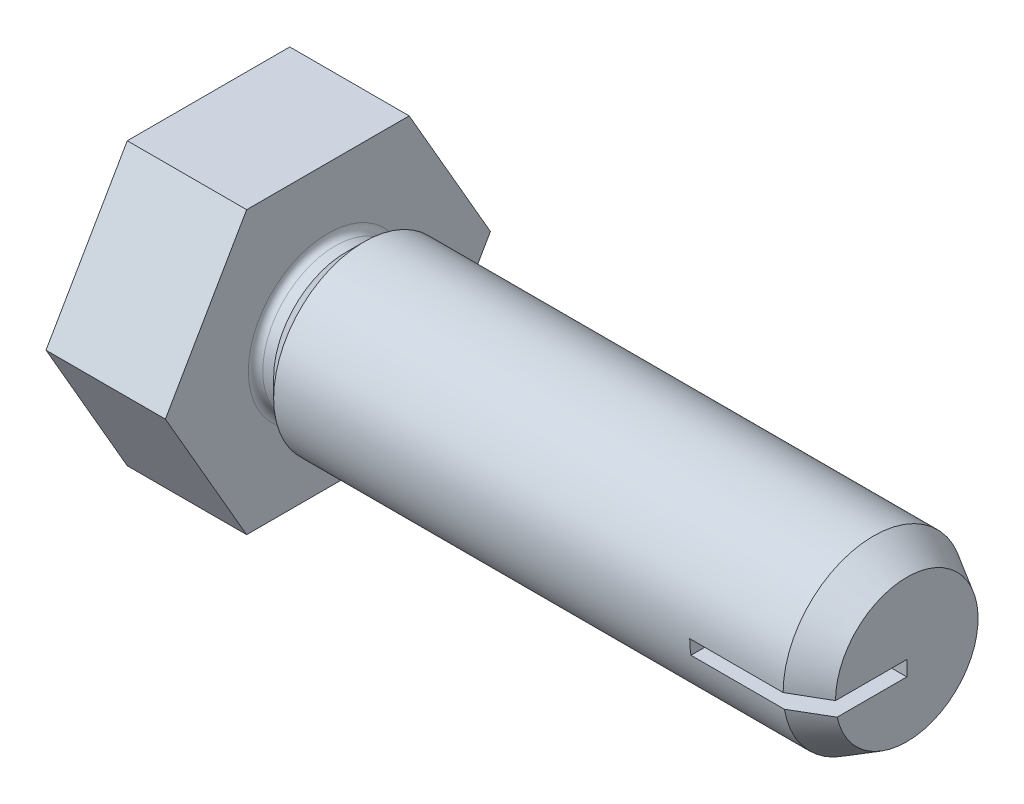
ISO-10303-21;
HEADER;
FILE_DESCRIPTION(('STEP AP214'),'2;1');
FILE_NAME('part.step','',(''),(''),'','','');
FILE_SCHEMA(('AUTOMOTIVE_DESIGN { 1 0 10303 214 1 1 1 1 }'));
ENDSEC;
DATA;
#1=APPLICATION_CONTEXT('core data for automotive mechanical design processes');
#2=APPLICATION_PROTOCOL_DEFINITION('international standard','automotive_design',2000,#1);
#3=PRODUCT_CONTEXT('',#1,'mechanical');
#4=PRODUCT('Part','Part','',(#3));
#5=PRODUCT_RELATED_PRODUCT_CATEGORY('part','',(#4));
#6=PRODUCT_DEFINITION_FORMATION('','',#4);
#7=PRODUCT_DEFINITION_CONTEXT('part definition',#1,'design');
#8=PRODUCT_DEFINITION('design','',#6,#7);
#9=PRODUCT_DEFINITION_SHAPE('','',#8);
#10=(LENGTH_UNIT() NAMED_UNIT(*) SI_UNIT(.MILLI.,.METRE.));
#11=(NAMED_UNIT(*) PLANE_ANGLE_UNIT() SI_UNIT($,.RADIAN.));
#12=(NAMED_UNIT(*) SI_UNIT($,.STERADIAN.) SOLID_ANGLE_UNIT());
#13=UNCERTAINTY_MEASURE_WITH_UNIT(LENGTH_MEASURE(1.E-05),#10,'distance_accuracy_value','');
#14=(GEOMETRIC_REPRESENTATION_CONTEXT(3) GLOBAL_UNCERTAINTY_ASSIGNED_CONTEXT((#13)) GLOBAL_UNIT_ASSIGNED_CONTEXT((#10,
#11,#12)) REPRESENTATION_CONTEXT('',''));
#15=CARTESIAN_POINT('',(0.,0.,0.));
#16=DIRECTION('',(0.,0.,1.));
#17=DIRECTION('',(1.,0.,0.));
#18=AXIS2_PLACEMENT_3D('',#15,#16,#17);
#19=CARTESIAN_POINT('',(0.,0.,0.));
#20=DIRECTION('',(-1.,0.,0.));
#21=DIRECTION('',(0.,0.,1.));
#22=AXIS2_PLACEMENT_3D('',#19,#20,#21);
#23=CYLINDRICAL_SURFACE('',#22,2.5);
#24=CARTESIAN_POINT('',(1.,0.,0.));
#25=DIRECTION('',(-1.,0.,0.));
#26=DIRECTION('',(0.,0.,1.));
#27=AXIS2_PLACEMENT_3D('',#24,#25,#26);
#28=CIRCLE('',#27,2.5);
#29=CARTESIAN_POINT('',(1.,0.,2.5));
#30=VERTEX_POINT('',#29);
#31=EDGE_CURVE('E234',#30,#30,#28,.T.);
#32=ORIENTED_EDGE('',*,*,#31,.F.);
#33=EDGE_LOOP('',(#32));
#34=FACE_BOUND('',#33,.T.);
#35=DIRECTION('',(-1.,0.,0.));
#36=VECTOR('',#35,1.);
#37=CARTESIAN_POINT('',(0.,0.,2.5));
#38=LINE('',#37,#36);
#39=CARTESIAN_POINT('',(15.0820130719885,0.,2.5));
#40=VERTEX_POINT('',#39);
#41=CARTESIAN_POINT('',(12.5,0.,2.5));
#42=VERTEX_POINT('',#41);
#43=EDGE_CURVE('E267',#40,#42,#38,.T.);
#44=ORIENTED_EDGE('',*,*,#43,.F.);
#45=CARTESIAN_POINT('',(15.0820130719885,0.,0.));
#46=DIRECTION('',(-1.,0.,0.));
#47=DIRECTION('',(0.,0.,1.));
#48=AXIS2_PLACEMENT_3D('',#45,#46,#47);
#49=CIRCLE('',#48,2.5);
#50=CARTESIAN_POINT('',(15.0820130719885,-0.416666666666667,2.46503324295817));
#51=VERTEX_POINT('',#50);
#52=EDGE_CURVE('E266',#40,#51,#49,.T.);
#53=ORIENTED_EDGE('',*,*,#52,.T.);
#54=DIRECTION('',(-1.,0.,0.));
#55=VECTOR('',#54,1.);
#56=CARTESIAN_POINT('',(0.,-0.416666666666669,2.46503324295817));
#57=LINE('',#56,#55);
#58=CARTESIAN_POINT('',(12.5,-0.416666666666667,2.46503324295817));
#59=VERTEX_POINT('',#58);
#60=EDGE_CURVE('E268',#59,#51,#57,.F.);
#61=ORIENTED_EDGE('',*,*,#60,.F.);
#62=CARTESIAN_POINT('',(12.5,0.,0.));
#63=DIRECTION('',(1.,0.,0.));
#64=DIRECTION('',(0.,0.,-1.));
#65=AXIS2_PLACEMENT_3D('',#62,#63,#64);
#66=CIRCLE('',#65,2.5);
#67=EDGE_CURVE('E99',#42,#59,#66,.T.);
#68=ORIENTED_EDGE('',*,*,#67,.F.);
#69=EDGE_LOOP('',(#44,#53,#61,#68));
#70=FACE_BOUND('',#69,.T.);
#71=ADVANCED_FACE('F125',(#34,#70),#23,.T.);
#72=CARTESIAN_POINT('',(15.0820130719885,0.,0.));
#73=DIRECTION('',(-1.,0.,0.));
#74=DIRECTION('',(0.,0.,1.));
#75=AXIS2_PLACEMENT_3D('',#72,#73,#74);
#76=CONICAL_SURFACE('',#75,2.5,0.523598775598292);
#77=ORIENTED_EDGE('',*,*,#52,.F.);
#78=DIRECTION('',(-0.866025403784442,0.,0.499999999999994));
#79=VECTOR('',#78,1.);
#80=CARTESIAN_POINT('',(19.4121400909107,0.,0.));
#81=LINE('',#80,#79);
#82=CARTESIAN_POINT('',(16.,0.,1.97));
#83=VERTEX_POINT('',#82);
#84=EDGE_CURVE('E247',#40,#83,#81,.F.);
#85=ORIENTED_EDGE('',*,*,#84,.T.);
#86=CARTESIAN_POINT('',(16.,0.,0.));
#87=DIRECTION('',(-1.,0.,0.));
#88=DIRECTION('',(0.,0.,1.));
#89=AXIS2_PLACEMENT_3D('',#86,#87,#88);
#90=CIRCLE('',#89,1.97);
#91=CARTESIAN_POINT('',(16.,-0.416666666666667,1.92543213042914));
#92=VERTEX_POINT('',#91);
#93=EDGE_CURVE('E264',#83,#92,#90,.T.);
#94=ORIENTED_EDGE('',*,*,#93,.T.);
#95=CARTESIAN_POINT('',(18.08614728264,-0.416666666666666,0.642241801362555));
#96=CARTESIAN_POINT('',(18.0510723416986,-0.416666666666666,0.666370497439099));
#97=CARTESIAN_POINT('',(18.0158209182071,-0.416666666666666,0.690239439500695));
#98=CARTESIAN_POINT('',(17.9450410807476,-0.416666666666666,0.737559607858169));
#99=CARTESIAN_POINT('',(17.9095126807947,-0.416666666666666,0.761010855094915));
#100=CARTESIAN_POINT('',(17.8026301976947,-0.416666666666666,0.830888074114942));
#101=CARTESIAN_POINT('',(17.7309693877561,-0.416666666666666,0.876843936993016));
#102=CARTESIAN_POINT('',(17.5871601845939,-0.416666666666666,0.967946816020336));
#103=CARTESIAN_POINT('',(17.5150119024295,-0.416666666666667,1.01309400838144));
#104=CARTESIAN_POINT('',(17.3703728328953,-0.416666666666667,1.1028426647793));
#105=CARTESIAN_POINT('',(17.2978820308339,-0.416666666666667,1.14744410510748));
#106=CARTESIAN_POINT('',(17.0861944626295,-0.416666666666667,1.27692130677648));
#107=CARTESIAN_POINT('',(16.946685589256,-0.416666666666667,1.36128610719151));
#108=CARTESIAN_POINT('',(16.6671871516271,-0.416666666666667,1.52921629261561));
#109=CARTESIAN_POINT('',(16.5271975820463,-0.416666666666667,1.61278166872952));
#110=CARTESIAN_POINT('',(16.1067337354645,-0.416666666666667,1.86277016745075));
#111=CARTESIAN_POINT('',(15.8258193014455,-0.416666666666667,2.02845244493768));
#112=CARTESIAN_POINT('',(15.3306932141405,-0.416666666666667,2.31940386962061));
#113=CARTESIAN_POINT('',(15.1165930973966,-0.416666666666667,2.44486357747066));
#114=CARTESIAN_POINT('',(14.6881891618265,-0.416666666666667,2.69543503391963));
#115=CARTESIAN_POINT('',(14.4738853429846,-0.416666666666667,2.82054678249146));
#116=CARTESIAN_POINT('',(14.0452309287218,-0.416666666666667,3.07049358647508));
#117=CARTESIAN_POINT('',(13.8308803859553,-0.416666666666667,3.19532873226625));
#118=CARTESIAN_POINT('',(13.4020836117564,-0.416666666666667,3.4448338547915));
#119=CARTESIAN_POINT('',(13.1876373804678,-0.416666666666667,3.56950383177238));
#120=CARTESIAN_POINT('',(12.9731611797261,-0.416666666666667,3.69412218194189));
#121=B_SPLINE_CURVE_WITH_KNOTS('',3,(#95,#96,#97,#98,#99,#100,#101,#102,#103,#104,#105,#106,
#107,#108,#109,#110,#111,#112,#113,#114,#115,#116,#117,#118,#119,#120),.UNSPECIFIED.,.F.,.F.,(4,
2,2,2,2,2,2,2,2,2,2,2,4),(0.,0.127714662585985,0.255422904152005,0.510805146378886,
0.766131045879196,1.02146799814593,1.51056493988736,1.99966731748115,2.97806477299339,
3.72251831916647,4.4669719232861,5.21112892497218,5.95528481348288),.UNSPECIFIED.);
#122=EDGE_CURVE('E459',#92,#51,#121,.T.);
#123=ORIENTED_EDGE('',*,*,#122,.T.);
#124=EDGE_LOOP('',(#77,#85,#94,#123));
#125=FACE_BOUND('',#124,.T.);
#126=ADVANCED_FACE('F261',(#125),#76,.T.);
#127=CARTESIAN_POINT('',(16.,2.5,0.));
#128=DIRECTION('',(-1.,0.,0.));
#129=DIRECTION('',(0.,0.,1.));
#130=AXIS2_PLACEMENT_3D('',#127,#128,#129);
#131=PLANE('',#130);
#132=DIRECTION('',(0.,0.,1.));
#133=VECTOR('',#132,1.);
#134=CARTESIAN_POINT('',(16.,0.,0.));
#135=LINE('',#134,#133);
#136=CARTESIAN_POINT('',(16.,0.,0.));
#137=VERTEX_POINT('',#136);
#138=EDGE_CURVE('E133',#137,#83,#135,.T.);
#139=ORIENTED_EDGE('',*,*,#138,.F.);
#140=DIRECTION('',(0.,1.,0.));
#141=VECTOR('',#140,1.);
#142=CARTESIAN_POINT('',(16.,0.,0.));
#143=LINE('',#142,#141);
#144=CARTESIAN_POINT('',(16.,-0.416666666666667,0.));
#145=VERTEX_POINT('',#144);
#146=EDGE_CURVE('E493',#145,#137,#143,.T.);
#147=ORIENTED_EDGE('',*,*,#146,.F.);
#148=DIRECTION('',(0.,0.,-1.));
#149=VECTOR('',#148,1.);
#150=CARTESIAN_POINT('',(16.,-0.416666666666667,0.));
#151=LINE('',#150,#149);
#152=EDGE_CURVE('E237',#92,#145,#151,.T.);
#153=ORIENTED_EDGE('',*,*,#152,.F.);
#154=ORIENTED_EDGE('',*,*,#93,.F.);
#155=EDGE_LOOP('',(#139,#147,#153,#154));
#156=FACE_BOUND('',#155,.T.);
#157=ADVANCED_FACE('F271',(#156),#131,.F.);
#158=CARTESIAN_POINT('',(1.,0.,0.));
#159=DIRECTION('',(1.,0.,0.));
#160=DIRECTION('',(0.,0.,-1.));
#161=AXIS2_PLACEMENT_3D('',#158,#159,#160);
#162=CONICAL_SURFACE('',#161,2.5,0.78539816339745);
#163=CARTESIAN_POINT('',(0.500000000000003,0.,0.));
#164=DIRECTION('',(-1.,0.,0.));
#165=DIRECTION('',(0.,0.,1.));
#166=AXIS2_PLACEMENT_3D('',#163,#164,#165);
#167=CIRCLE('',#166,2.);
#168=CARTESIAN_POINT('',(0.500000000000003,0.,2.));
#169=VERTEX_POINT('',#168);
#170=EDGE_CURVE('E231',#169,#169,#167,.T.);
#171=ORIENTED_EDGE('',*,*,#170,.F.);
#172=EDGE_LOOP('',(#171));
#173=FACE_BOUND('',#172,.T.);
#174=ORIENTED_EDGE('',*,*,#31,.T.);
#175=EDGE_LOOP('',(#174));
#176=FACE_BOUND('',#175,.T.);
#177=ADVANCED_FACE('F325',(#173,#176),#162,.T.);
#178=CARTESIAN_POINT('',(0.,0.,0.));
#179=DIRECTION('',(-1.,0.,0.));
#180=DIRECTION('',(0.,0.,1.));
#181=AXIS2_PLACEMENT_3D('',#178,#179,#180);
#182=CYLINDRICAL_SURFACE('',#181,2.);
#183=CARTESIAN_POINT('',(0.200000000000001,0.,0.));
#184=DIRECTION('',(-1.,0.,0.));
#185=DIRECTION('',(0.,0.,1.));
#186=AXIS2_PLACEMENT_3D('',#183,#184,#185);
#187=CIRCLE('',#186,2.);
#188=CARTESIAN_POINT('',(0.200000000000001,0.,2.));
#189=VERTEX_POINT('',#188);
#190=EDGE_CURVE('E227',#189,#189,#187,.T.);
#191=ORIENTED_EDGE('',*,*,#190,.F.);
#192=EDGE_LOOP('',(#191));
#193=FACE_BOUND('',#192,.T.);
#194=ORIENTED_EDGE('',*,*,#170,.T.);
#195=EDGE_LOOP('',(#194));
#196=FACE_BOUND('',#195,.T.);
#197=ADVANCED_FACE('F331',(#193,#196),#182,.T.);
#198=CARTESIAN_POINT('',(0.200000000000001,0.,0.));
#199=DIRECTION('',(-1.,0.,0.));
#200=DIRECTION('',(0.,0.,1.));
#201=AXIS2_PLACEMENT_3D('',#198,#199,#200);
#202=TOROIDAL_SURFACE('',#201,2.2,0.2);
#203=CARTESIAN_POINT('',(0.,0.,0.));
#204=DIRECTION('',(-1.,0.,0.));
#205=DIRECTION('',(0.,0.,1.));
#206=AXIS2_PLACEMENT_3D('',#203,#204,#205);
#207=CIRCLE('',#206,2.2);
#208=CARTESIAN_POINT('',(0.,0.,2.2));
#209=VERTEX_POINT('',#208);
#210=EDGE_CURVE('E224',#209,#209,#207,.T.);
#211=ORIENTED_EDGE('',*,*,#210,.F.);
#212=EDGE_LOOP('',(#211));
#213=FACE_BOUND('',#212,.T.);
#214=ORIENTED_EDGE('',*,*,#190,.T.);
#215=EDGE_LOOP('',(#214));
#216=FACE_BOUND('',#215,.T.);
#217=ADVANCED_FACE('F336',(#213,#216),#202,.F.);
#218=CARTESIAN_POINT('',(0.,3.89,0.));
#219=DIRECTION('',(-1.,0.,0.));
#220=DIRECTION('',(0.,0.,1.));
#221=AXIS2_PLACEMENT_3D('',#218,#219,#220);
#222=PLANE('',#221);
#223=DIRECTION('',(0.,0.866025403784439,0.5));
#224=VECTOR('',#223,1.);
#225=CARTESIAN_POINT('',(0.,1.945,-3.36883882072147));
#226=LINE('',#225,#224);
#227=CARTESIAN_POINT('',(0.,0.,-4.49178509429529));
#228=VERTEX_POINT('',#227);
#229=CARTESIAN_POINT('',(0.,3.89,-2.24589254714765));
#230=VERTEX_POINT('',#229);
#231=EDGE_CURVE('E149',#228,#230,#226,.T.);
#232=ORIENTED_EDGE('',*,*,#231,.T.);
#233=DIRECTION('',(0.,0.,1.));
#234=VECTOR('',#233,1.);
#235=CARTESIAN_POINT('',(0.,3.89,0.));
#236=LINE('',#235,#234);
#237=CARTESIAN_POINT('',(0.,3.89,2.24589254714765));
#238=VERTEX_POINT('',#237);
#239=EDGE_CURVE('E283',#230,#238,#236,.T.);
#240=ORIENTED_EDGE('',*,*,#239,.T.);
#241=DIRECTION('',(0.,-0.866025403784439,0.5));
#242=VECTOR('',#241,1.);
#243=CARTESIAN_POINT('',(0.,0.,4.49178509429529));
#244=LINE('',#243,#242);
#245=CARTESIAN_POINT('',(0.,0.,4.49178509429529));
#246=VERTEX_POINT('',#245);
#247=EDGE_CURVE('E204',#238,#246,#244,.T.);
#248=ORIENTED_EDGE('',*,*,#247,.T.);
#249=DIRECTION('',(0.,-0.866025403784439,-0.5));
#250=VECTOR('',#249,1.);
#251=CARTESIAN_POINT('',(0.,-3.89,2.24589254714765));
#252=LINE('',#251,#250);
#253=CARTESIAN_POINT('',(0.,-3.89,2.24589254714765));
#254=VERTEX_POINT('',#253);
#255=EDGE_CURVE('E198',#246,#254,#252,.T.);
#256=ORIENTED_EDGE('',*,*,#255,.T.);
#257=DIRECTION('',(0.,0.,-1.));
#258=VECTOR('',#257,1.);
#259=CARTESIAN_POINT('',(0.,-3.89,-2.24589254714764));
#260=LINE('',#259,#258);
#261=CARTESIAN_POINT('',(0.,-3.89,-2.24589254714764));
#262=VERTEX_POINT('',#261);
#263=EDGE_CURVE('E188',#254,#262,#260,.T.);
#264=ORIENTED_EDGE('',*,*,#263,.T.);
#265=DIRECTION('',(0.,0.866025403784439,-0.5));
#266=VECTOR('',#265,1.);
#267=CARTESIAN_POINT('',(0.,-1.945,-3.36883882072147));
#268=LINE('',#267,#266);
#269=EDGE_CURVE('E228',#262,#228,#268,.T.);
#270=ORIENTED_EDGE('',*,*,#269,.T.);
#271=EDGE_LOOP('',(#232,#240,#248,#256,#264,#270));
#272=FACE_BOUND('',#271,.T.);
#273=ORIENTED_EDGE('',*,*,#210,.T.);
#274=EDGE_LOOP('',(#273));
#275=FACE_BOUND('',#274,.T.);
#276=ADVANCED_FACE('F201',(#272,#275),#222,.F.);
#277=CARTESIAN_POINT('',(11.8841463022521,-1.945,-3.36883882072147));
#278=DIRECTION('',(0.,-0.5,-0.866025403784438));
#279=DIRECTION('',(0.,0.866025403784439,-0.5));
#280=AXIS2_PLACEMENT_3D('',#277,#278,#279);
#281=PLANE('',#280);
#282=DIRECTION('',(-1.,0.,0.));
#283=VECTOR('',#282,1.);
#284=CARTESIAN_POINT('',(11.8841463022521,-3.89,-2.24589254714764));
#285=LINE('',#284,#283);
#286=CARTESIAN_POINT('',(-3.3,-3.89,-2.24589254714764));
#287=VERTEX_POINT('',#286);
#288=EDGE_CURVE('E196',#262,#287,#285,.T.);
#289=ORIENTED_EDGE('',*,*,#288,.T.);
#290=DIRECTION('',(0.,-0.866025403784439,0.5));
#291=VECTOR('',#290,1.);
#292=CARTESIAN_POINT('',(-3.3,-1.945,-3.36883882072147));
#293=LINE('',#292,#291);
#294=CARTESIAN_POINT('',(-3.3,0.,-4.49178509429529));
#295=VERTEX_POINT('',#294);
#296=EDGE_CURVE('E282',#295,#287,#293,.T.);
#297=ORIENTED_EDGE('',*,*,#296,.F.);
#298=DIRECTION('',(-1.,0.,0.));
#299=VECTOR('',#298,1.);
#300=CARTESIAN_POINT('',(11.8841463022521,0.,-4.49178509429529));
#301=LINE('',#300,#299);
#302=EDGE_CURVE('E279',#228,#295,#301,.T.);
#303=ORIENTED_EDGE('',*,*,#302,.F.);
#304=ORIENTED_EDGE('',*,*,#269,.F.);
#305=EDGE_LOOP('',(#289,#297,#303,#304));
#306=FACE_BOUND('',#305,.T.);
#307=ADVANCED_FACE('F298',(#306),#281,.T.);
#308=CARTESIAN_POINT('',(11.8841463022521,1.945,-3.36883882072147));
#309=DIRECTION('',(0.,0.5,-0.866025403784439));
#310=DIRECTION('',(0.,0.866025403784439,0.5));
#311=AXIS2_PLACEMENT_3D('',#308,#309,#310);
#312=PLANE('',#311);
#313=ORIENTED_EDGE('',*,*,#302,.T.);
#314=DIRECTION('',(0.,-0.866025403784439,-0.5));
#315=VECTOR('',#314,1.);
#316=CARTESIAN_POINT('',(-3.3,1.945,-3.36883882072147));
#317=LINE('',#316,#315);
#318=CARTESIAN_POINT('',(-3.3,3.89,-2.24589254714765));
#319=VERTEX_POINT('',#318);
#320=EDGE_CURVE('E280',#319,#295,#317,.T.);
#321=ORIENTED_EDGE('',*,*,#320,.F.);
#322=DIRECTION('',(-1.,0.,0.));
#323=VECTOR('',#322,1.);
#324=CARTESIAN_POINT('',(11.8841463022521,3.89,-2.24589254714765));
#325=LINE('',#324,#323);
#326=EDGE_CURVE('E288',#230,#319,#325,.T.);
#327=ORIENTED_EDGE('',*,*,#326,.F.);
#328=ORIENTED_EDGE('',*,*,#231,.F.);
#329=EDGE_LOOP('',(#313,#321,#327,#328));
#330=FACE_BOUND('',#329,.T.);
#331=ADVANCED_FACE('F300',(#330),#312,.T.);
#332=CARTESIAN_POINT('',(11.8841463022521,3.89,0.));
#333=DIRECTION('',(0.,1.,0.));
#334=DIRECTION('',(0.,0.,1.));
#335=AXIS2_PLACEMENT_3D('',#332,#333,#334);
#336=PLANE('',#335);
#337=ORIENTED_EDGE('',*,*,#326,.T.);
#338=DIRECTION('',(0.,0.,-1.));
#339=VECTOR('',#338,1.);
#340=CARTESIAN_POINT('',(-3.3,3.89,0.));
#341=LINE('',#340,#339);
#342=CARTESIAN_POINT('',(-3.3,3.89,2.24589254714765));
#343=VERTEX_POINT('',#342);
#344=EDGE_CURVE('E223',#343,#319,#341,.T.);
#345=ORIENTED_EDGE('',*,*,#344,.F.);
#346=DIRECTION('',(-1.,0.,0.));
#347=VECTOR('',#346,1.);
#348=CARTESIAN_POINT('',(11.8841463022521,3.89,2.24589254714765));
#349=LINE('',#348,#347);
#350=EDGE_CURVE('E212',#238,#343,#349,.T.);
#351=ORIENTED_EDGE('',*,*,#350,.F.);
#352=ORIENTED_EDGE('',*,*,#239,.F.);
#353=EDGE_LOOP('',(#337,#345,#351,#352));
#354=FACE_BOUND('',#353,.T.);
#355=ADVANCED_FACE('F302',(#354),#336,.T.);
#356=CARTESIAN_POINT('',(11.8841463022521,-3.89,-2.24589254714764));
#357=DIRECTION('',(0.,-1.,0.));
#358=DIRECTION('',(0.,0.,-1.));
#359=AXIS2_PLACEMENT_3D('',#356,#357,#358);
#360=PLANE('',#359);
#361=DIRECTION('',(-1.,0.,0.));
#362=VECTOR('',#361,1.);
#363=CARTESIAN_POINT('',(11.8841463022521,-3.89,2.24589254714765));
#364=LINE('',#363,#362);
#365=CARTESIAN_POINT('',(-3.3,-3.89,2.24589254714765));
#366=VERTEX_POINT('',#365);
#367=EDGE_CURVE('E193',#254,#366,#364,.T.);
#368=ORIENTED_EDGE('',*,*,#367,.T.);
#369=DIRECTION('',(0.,0.,1.));
#370=VECTOR('',#369,1.);
#371=CARTESIAN_POINT('',(-3.3,-3.89,-2.24589254714764));
#372=LINE('',#371,#370);
#373=EDGE_CURVE('E215',#287,#366,#372,.T.);
#374=ORIENTED_EDGE('',*,*,#373,.F.);
#375=ORIENTED_EDGE('',*,*,#288,.F.);
#376=ORIENTED_EDGE('',*,*,#263,.F.);
#377=EDGE_LOOP('',(#368,#374,#375,#376));
#378=FACE_BOUND('',#377,.T.);
#379=ADVANCED_FACE('F190',(#378),#360,.T.);
#380=CARTESIAN_POINT('',(11.8841463022521,-3.89,2.24589254714765));
#381=DIRECTION('',(0.,-0.5,0.866025403784439));
#382=DIRECTION('',(0.,-0.866025403784439,-0.5));
#383=AXIS2_PLACEMENT_3D('',#380,#381,#382);
#384=PLANE('',#383);
#385=DIRECTION('',(-1.,0.,0.));
#386=VECTOR('',#385,1.);
#387=CARTESIAN_POINT('',(11.8841463022521,0.,4.49178509429529));
#388=LINE('',#387,#386);
#389=CARTESIAN_POINT('',(-3.3,0.,4.49178509429529));
#390=VERTEX_POINT('',#389);
#391=EDGE_CURVE('E220',#246,#390,#388,.T.);
#392=ORIENTED_EDGE('',*,*,#391,.T.);
#393=DIRECTION('',(0.,0.866025403784439,0.5));
#394=VECTOR('',#393,1.);
#395=CARTESIAN_POINT('',(-3.3,-3.89,2.24589254714765));
#396=LINE('',#395,#394);
#397=EDGE_CURVE('E210',#366,#390,#396,.T.);
#398=ORIENTED_EDGE('',*,*,#397,.F.);
#399=ORIENTED_EDGE('',*,*,#367,.F.);
#400=ORIENTED_EDGE('',*,*,#255,.F.);
#401=EDGE_LOOP('',(#392,#398,#399,#400));
#402=FACE_BOUND('',#401,.T.);
#403=ADVANCED_FACE('F209',(#402),#384,.T.);
#404=CARTESIAN_POINT('',(11.8841463022521,0.,4.49178509429529));
#405=DIRECTION('',(0.,0.5,0.866025403784438));
#406=DIRECTION('',(0.,-0.866025403784439,0.5));
#407=AXIS2_PLACEMENT_3D('',#404,#405,#406);
#408=PLANE('',#407);
#409=DIRECTION('',(0.,0.866025403784438,-0.5));
#410=VECTOR('',#409,1.);
#411=CARTESIAN_POINT('',(-3.3,0.,4.49178509429529));
#412=LINE('',#411,#410);
#413=EDGE_CURVE('E273',#390,#343,#412,.T.);
#414=ORIENTED_EDGE('',*,*,#413,.F.);
#415=ORIENTED_EDGE('',*,*,#391,.F.);
#416=ORIENTED_EDGE('',*,*,#247,.F.);
#417=ORIENTED_EDGE('',*,*,#350,.T.);
#418=EDGE_LOOP('',(#414,#415,#416,#417));
#419=FACE_BOUND('',#418,.T.);
#420=ADVANCED_FACE('F304',(#419),#408,.T.);
#421=CARTESIAN_POINT('',(-3.3,3.89,0.));
#422=DIRECTION('',(1.,0.,0.));
#423=DIRECTION('',(0.,0.,-1.));
#424=AXIS2_PLACEMENT_3D('',#421,#422,#423);
#425=PLANE('',#424);
#426=CARTESIAN_POINT('',(-3.3,0.,0.));
#427=DIRECTION('',(-1.,0.,0.));
#428=DIRECTION('',(0.,0.,1.));
#429=AXIS2_PLACEMENT_3D('',#426,#427,#428);
#430=CIRCLE('',#429,3.112);
#431=CARTESIAN_POINT('',(-3.3,0.,3.112));
#432=VERTEX_POINT('',#431);
#433=EDGE_CURVE('E496',#432,#432,#430,.T.);
#434=ORIENTED_EDGE('',*,*,#433,.F.);
#435=EDGE_LOOP('',(#434));
#436=FACE_BOUND('',#435,.T.);
#437=ORIENTED_EDGE('',*,*,#397,.T.);
#438=ORIENTED_EDGE('',*,*,#413,.T.);
#439=ORIENTED_EDGE('',*,*,#344,.T.);
#440=ORIENTED_EDGE('',*,*,#320,.T.);
#441=ORIENTED_EDGE('',*,*,#296,.T.);
#442=ORIENTED_EDGE('',*,*,#373,.T.);
#443=EDGE_LOOP('',(#437,#438,#439,#440,#441,#442));
#444=FACE_BOUND('',#443,.T.);
#445=ADVANCED_FACE('F127',(#436,#444),#425,.F.);
#446=CARTESIAN_POINT('',(12.5,0.,4.49178509429529));
#447=DIRECTION('',(1.,0.,0.));
#448=DIRECTION('',(0.,0.,-1.));
#449=AXIS2_PLACEMENT_3D('',#446,#447,#448);
#450=PLANE('',#449);
#451=ORIENTED_EDGE('',*,*,#67,.T.);
#452=DIRECTION('',(0.,0.,-1.));
#453=VECTOR('',#452,1.);
#454=CARTESIAN_POINT('',(12.5,-0.416666666666667,4.49178509429529));
#455=LINE('',#454,#453);
#456=CARTESIAN_POINT('',(12.5,-0.416666666666667,0.));
#457=VERTEX_POINT('',#456);
#458=EDGE_CURVE('E479',#59,#457,#455,.T.);
#459=ORIENTED_EDGE('',*,*,#458,.T.);
#460=DIRECTION('',(0.,-1.,0.));
#461=VECTOR('',#460,1.);
#462=CARTESIAN_POINT('',(12.5,0.,0.));
#463=LINE('',#462,#461);
#464=CARTESIAN_POINT('',(12.5,0.,0.));
#465=VERTEX_POINT('',#464);
#466=EDGE_CURVE('E478',#465,#457,#463,.T.);
#467=ORIENTED_EDGE('',*,*,#466,.F.);
#468=DIRECTION('',(0.,0.,-1.));
#469=VECTOR('',#468,1.);
#470=CARTESIAN_POINT('',(12.5,0.,4.49178509429529));
#471=LINE('',#470,#469);
#472=EDGE_CURVE('E466',#42,#465,#471,.T.);
#473=ORIENTED_EDGE('',*,*,#472,.F.);
#474=EDGE_LOOP('',(#451,#459,#467,#473));
#475=FACE_BOUND('',#474,.T.);
#476=ADVANCED_FACE('F311',(#475),#450,.T.);
#477=CARTESIAN_POINT('',(16.,0.,4.49178509429529));
#478=DIRECTION('',(0.,-1.,0.));
#479=DIRECTION('',(1.,0.,0.));
#480=AXIS2_PLACEMENT_3D('',#477,#478,#479);
#481=PLANE('',#480);
#482=ORIENTED_EDGE('',*,*,#43,.T.);
#483=ORIENTED_EDGE('',*,*,#472,.T.);
#484=DIRECTION('',(-1.,0.,0.));
#485=VECTOR('',#484,1.);
#486=CARTESIAN_POINT('',(16.,0.,0.));
#487=LINE('',#486,#485);
#488=EDGE_CURVE('E252',#137,#465,#487,.T.);
#489=ORIENTED_EDGE('',*,*,#488,.F.);
#490=ORIENTED_EDGE('',*,*,#138,.T.);
#491=ORIENTED_EDGE('',*,*,#84,.F.);
#492=EDGE_LOOP('',(#482,#483,#489,#490,#491));
#493=FACE_BOUND('',#492,.T.);
#494=ADVANCED_FACE('F246',(#493),#481,.T.);
#495=CARTESIAN_POINT('',(16.,-0.416666666666667,4.49178509429529));
#496=DIRECTION('',(0.,1.,0.));
#497=DIRECTION('',(-1.,0.,0.));
#498=AXIS2_PLACEMENT_3D('',#495,#496,#497);
#499=PLANE('',#498);
#500=ORIENTED_EDGE('',*,*,#60,.T.);
#501=ORIENTED_EDGE('',*,*,#122,.F.);
#502=ORIENTED_EDGE('',*,*,#152,.T.);
#503=DIRECTION('',(1.,0.,0.));
#504=VECTOR('',#503,1.);
#505=CARTESIAN_POINT('',(16.,-0.416666666666667,0.));
#506=LINE('',#505,#504);
#507=EDGE_CURVE('E140',#457,#145,#506,.T.);
#508=ORIENTED_EDGE('',*,*,#507,.F.);
#509=ORIENTED_EDGE('',*,*,#458,.F.);
#510=EDGE_LOOP('',(#500,#501,#502,#508,#509));
#511=FACE_BOUND('',#510,.T.);
#512=ADVANCED_FACE('F409',(#511),#499,.T.);
#513=CARTESIAN_POINT('',(16.,0.,0.));
#514=DIRECTION('',(0.,0.,-1.));
#515=DIRECTION('',(-1.,0.,0.));
#516=AXIS2_PLACEMENT_3D('',#513,#514,#515);
#517=PLANE('',#516);
#518=ORIENTED_EDGE('',*,*,#146,.T.);
#519=ORIENTED_EDGE('',*,*,#488,.T.);
#520=ORIENTED_EDGE('',*,*,#466,.T.);
#521=ORIENTED_EDGE('',*,*,#507,.T.);
#522=EDGE_LOOP('',(#518,#519,#520,#521));
#523=FACE_BOUND('',#522,.T.);
#524=ADVANCED_FACE('F417',(#523),#517,.F.);
#525=CARTESIAN_POINT('',(-2.64,0.,0.));
#526=DIRECTION('',(-1.,0.,0.));
#527=DIRECTION('',(0.,0.,1.));
#528=AXIS2_PLACEMENT_3D('',#525,#526,#527);
#529=CYLINDRICAL_SURFACE('',#528,3.112);
#530=CARTESIAN_POINT('',(-2.64,0.,0.));
#531=DIRECTION('',(-1.,0.,0.));
#532=DIRECTION('',(0.,0.,1.));
#533=AXIS2_PLACEMENT_3D('',#530,#531,#532);
#534=CIRCLE('',#533,3.112);
#535=CARTESIAN_POINT('',(-2.64,0.,3.112));
#536=VERTEX_POINT('',#535);
#537=EDGE_CURVE('E495',#536,#536,#534,.T.);
#538=ORIENTED_EDGE('',*,*,#537,.F.);
#539=EDGE_LOOP('',(#538));
#540=FACE_BOUND('',#539,.T.);
#541=ORIENTED_EDGE('',*,*,#433,.T.);
#542=EDGE_LOOP('',(#541));
#543=FACE_BOUND('',#542,.T.);
#544=ADVANCED_FACE('F427',(#540,#543),#529,.F.);
#545=CARTESIAN_POINT('',(-2.64,0.,0.));
#546=DIRECTION('',(-1.,0.,0.));
#547=DIRECTION('',(0.,0.,1.));
#548=AXIS2_PLACEMENT_3D('',#545,#546,#547);
#549=PLANE('',#548);
#550=ORIENTED_EDGE('',*,*,#537,.T.);
#551=EDGE_LOOP('',(#550));
#552=FACE_BOUND('',#551,.T.);
#553=ADVANCED_FACE('F442',(#552),#549,.T.);
#554=CLOSED_SHELL('',(#71,#126,#157,#177,#197,#217,#276,#307,#331,#355,#379,#403,#420,#445,#476,
#494,#512,#524,#544,#553));
#555=MANIFOLD_SOLID_BREP('B7',#554);
#556=ADVANCED_BREP_SHAPE_REPRESENTATION('',(#18,#555),#14);
#557=SHAPE_DEFINITION_REPRESENTATION(#9,#556);
ENDSEC;
END-ISO-10303-21;
